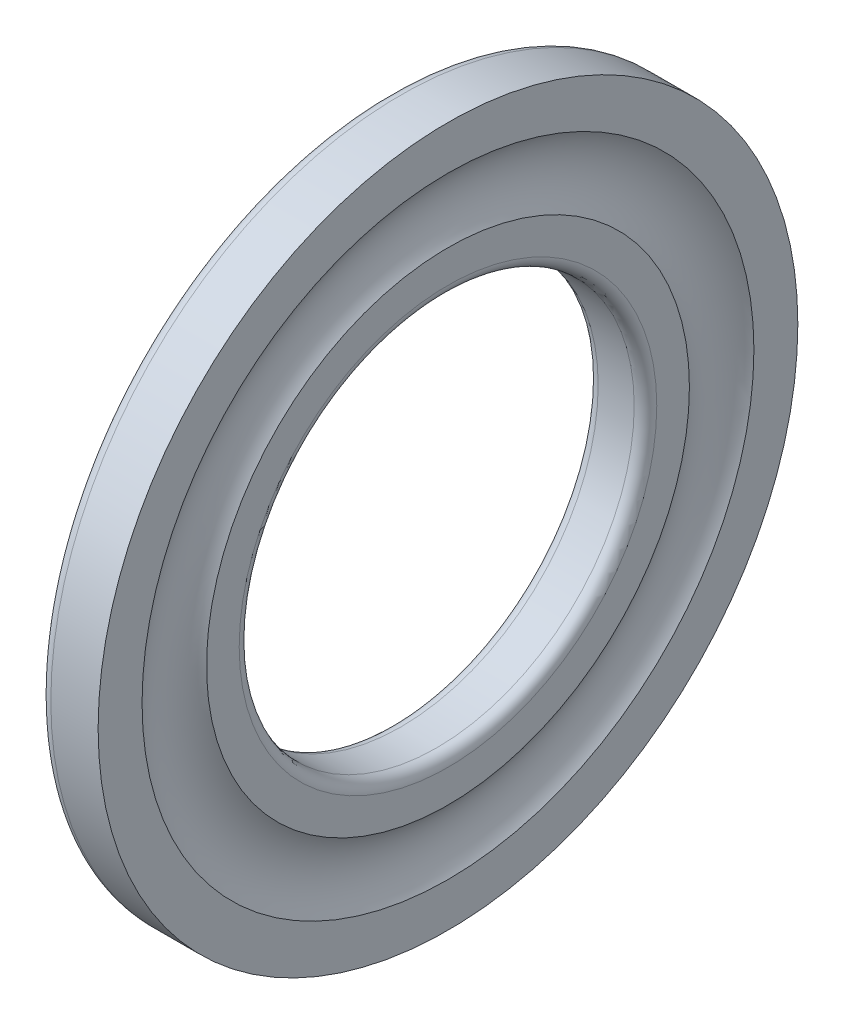
ISO-10303-21;
HEADER;
FILE_DESCRIPTION(('STEP AP214'),'2;1');
FILE_NAME('part.step','',(''),(''),'','','');
FILE_SCHEMA(('AUTOMOTIVE_DESIGN { 1 0 10303 214 1 1 1 1 }'));
ENDSEC;
DATA;
#1=APPLICATION_CONTEXT('core data for automotive mechanical design processes');
#2=APPLICATION_PROTOCOL_DEFINITION('international standard','automotive_design',2000,#1);
#3=PRODUCT_CONTEXT('',#1,'mechanical');
#4=PRODUCT('Part','Part','',(#3));
#5=PRODUCT_RELATED_PRODUCT_CATEGORY('part','',(#4));
#6=PRODUCT_DEFINITION_FORMATION('','',#4);
#7=PRODUCT_DEFINITION_CONTEXT('part definition',#1,'design');
#8=PRODUCT_DEFINITION('design','',#6,#7);
#9=PRODUCT_DEFINITION_SHAPE('','',#8);
#10=(LENGTH_UNIT() NAMED_UNIT(*) SI_UNIT(.MILLI.,.METRE.));
#11=(NAMED_UNIT(*) PLANE_ANGLE_UNIT() SI_UNIT($,.RADIAN.));
#12=(NAMED_UNIT(*) SI_UNIT($,.STERADIAN.) SOLID_ANGLE_UNIT());
#13=UNCERTAINTY_MEASURE_WITH_UNIT(LENGTH_MEASURE(1.E-05),#10,'distance_accuracy_value','');
#14=(GEOMETRIC_REPRESENTATION_CONTEXT(3) GLOBAL_UNCERTAINTY_ASSIGNED_CONTEXT((#13)) GLOBAL_UNIT_ASSIGNED_CONTEXT((#10,
#11,#12)) REPRESENTATION_CONTEXT('',''));
#15=CARTESIAN_POINT('',(0.,0.,0.));
#16=DIRECTION('',(0.,0.,1.));
#17=DIRECTION('',(1.,0.,0.));
#18=AXIS2_PLACEMENT_3D('',#15,#16,#17);
#19=CARTESIAN_POINT('',(5.19,18.5,0.));
#20=DIRECTION('',(1.,0.,0.));
#21=DIRECTION('',(0.,0.,-1.));
#22=AXIS2_PLACEMENT_3D('',#19,#20,#21);
#23=PLANE('',#22);
#24=CARTESIAN_POINT('',(5.19,0.,0.));
#25=DIRECTION('',(1.,0.,0.));
#26=DIRECTION('',(0.,0.,-1.));
#27=AXIS2_PLACEMENT_3D('',#24,#25,#26);
#28=CIRCLE('',#27,18.5);
#29=CARTESIAN_POINT('',(5.19,0.,-18.5));
#30=VERTEX_POINT('',#29);
#31=EDGE_CURVE('E114',#30,#30,#28,.T.);
#32=ORIENTED_EDGE('',*,*,#31,.F.);
#33=EDGE_LOOP('',(#32));
#34=FACE_BOUND('',#33,.T.);
#35=CARTESIAN_POINT('',(5.19,0.,0.));
#36=DIRECTION('',(1.,0.,0.));
#37=DIRECTION('',(0.,0.,-1.));
#38=AXIS2_PLACEMENT_3D('',#35,#36,#37);
#39=CIRCLE('',#38,21.3925);
#40=CARTESIAN_POINT('',(5.19,0.,-21.3925));
#41=VERTEX_POINT('',#40);
#42=EDGE_CURVE('E18',#41,#41,#39,.T.);
#43=ORIENTED_EDGE('',*,*,#42,.T.);
#44=EDGE_LOOP('',(#43));
#45=FACE_BOUND('',#44,.T.);
#46=ADVANCED_FACE('F14',(#34,#45),#23,.T.);
#47=CARTESIAN_POINT('',(8.99999999999999,0.,0.));
#48=DIRECTION('',(1.,0.,0.));
#49=DIRECTION('',(0.,0.,-1.));
#50=AXIS2_PLACEMENT_3D('',#47,#48,#49);
#51=TOROIDAL_SURFACE('',#50,24.25,4.7625);
#52=CARTESIAN_POINT('',(5.19,0.,0.));
#53=DIRECTION('',(1.,0.,0.));
#54=DIRECTION('',(0.,0.,-1.));
#55=AXIS2_PLACEMENT_3D('',#52,#53,#54);
#56=CIRCLE('',#55,27.1075);
#57=CARTESIAN_POINT('',(5.19,0.,-27.1075));
#58=VERTEX_POINT('',#57);
#59=EDGE_CURVE('E85',#58,#58,#56,.F.);
#60=ORIENTED_EDGE('',*,*,#59,.F.);
#61=EDGE_LOOP('',(#60));
#62=FACE_BOUND('',#61,.T.);
#63=ORIENTED_EDGE('',*,*,#42,.F.);
#64=EDGE_LOOP('',(#63));
#65=FACE_BOUND('',#64,.T.);
#66=ADVANCED_FACE('F98',(#62,#65),#51,.F.);
#67=CARTESIAN_POINT('',(4.19,0.,0.));
#68=DIRECTION('',(1.,0.,0.));
#69=DIRECTION('',(0.,0.,-1.));
#70=AXIS2_PLACEMENT_3D('',#67,#68,#69);
#71=TOROIDAL_SURFACE('',#70,18.5,0.999999999999997);
#72=CARTESIAN_POINT('',(4.19,0.,0.));
#73=DIRECTION('',(-1.,0.,0.));
#74=DIRECTION('',(0.,0.,1.));
#75=AXIS2_PLACEMENT_3D('',#72,#73,#74);
#76=CIRCLE('',#75,17.5);
#77=CARTESIAN_POINT('',(4.19,0.,17.5));
#78=VERTEX_POINT('',#77);
#79=EDGE_CURVE('E77',#78,#78,#76,.T.);
#80=ORIENTED_EDGE('',*,*,#79,.T.);
#81=EDGE_LOOP('',(#80));
#82=FACE_BOUND('',#81,.T.);
#83=ORIENTED_EDGE('',*,*,#31,.T.);
#84=EDGE_LOOP('',(#83));
#85=FACE_BOUND('',#84,.T.);
#86=ADVANCED_FACE('F93',(#82,#85),#71,.T.);
#87=CARTESIAN_POINT('',(5.19,27.1075,0.));
#88=DIRECTION('',(1.,0.,0.));
#89=DIRECTION('',(0.,0.,-1.));
#90=AXIS2_PLACEMENT_3D('',#87,#88,#89);
#91=PLANE('',#90);
#92=ORIENTED_EDGE('',*,*,#59,.T.);
#93=EDGE_LOOP('',(#92));
#94=FACE_BOUND('',#93,.T.);
#95=CARTESIAN_POINT('',(5.19,0.,0.));
#96=DIRECTION('',(-1.,0.,0.));
#97=DIRECTION('',(0.,0.,1.));
#98=AXIS2_PLACEMENT_3D('',#95,#96,#97);
#99=CIRCLE('',#98,31.);
#100=CARTESIAN_POINT('',(5.19,0.,31.));
#101=VERTEX_POINT('',#100);
#102=EDGE_CURVE('E37',#101,#101,#99,.T.);
#103=ORIENTED_EDGE('',*,*,#102,.F.);
#104=EDGE_LOOP('',(#103));
#105=FACE_BOUND('',#104,.T.);
#106=ADVANCED_FACE('F97',(#94,#105),#91,.T.);
#107=CARTESIAN_POINT('',(5.19,0.,0.));
#108=DIRECTION('',(-1.,0.,0.));
#109=DIRECTION('',(0.,0.,1.));
#110=AXIS2_PLACEMENT_3D('',#107,#108,#109);
#111=CYLINDRICAL_SURFACE('',#110,17.5);
#112=CARTESIAN_POINT('',(0.999999999999998,0.,0.));
#113=DIRECTION('',(1.,0.,0.));
#114=DIRECTION('',(0.,0.,-1.));
#115=AXIS2_PLACEMENT_3D('',#112,#113,#114);
#116=CIRCLE('',#115,17.5);
#117=CARTESIAN_POINT('',(0.999999999999998,0.,-17.5));
#118=VERTEX_POINT('',#117);
#119=EDGE_CURVE('E32',#118,#118,#116,.T.);
#120=ORIENTED_EDGE('',*,*,#119,.F.);
#121=EDGE_LOOP('',(#120));
#122=FACE_BOUND('',#121,.T.);
#123=ORIENTED_EDGE('',*,*,#79,.F.);
#124=EDGE_LOOP('',(#123));
#125=FACE_BOUND('',#124,.T.);
#126=ADVANCED_FACE('F149',(#122,#125),#111,.F.);
#127=CARTESIAN_POINT('',(5.19,0.,0.));
#128=DIRECTION('',(-1.,0.,0.));
#129=DIRECTION('',(0.,0.,1.));
#130=AXIS2_PLACEMENT_3D('',#127,#128,#129);
#131=CYLINDRICAL_SURFACE('',#130,31.);
#132=ORIENTED_EDGE('',*,*,#102,.T.);
#133=EDGE_LOOP('',(#132));
#134=FACE_BOUND('',#133,.T.);
#135=CARTESIAN_POINT('',(0.999999999999999,0.,0.));
#136=DIRECTION('',(1.,0.,0.));
#137=DIRECTION('',(0.,0.,-1.));
#138=AXIS2_PLACEMENT_3D('',#135,#136,#137);
#139=CIRCLE('',#138,31.);
#140=CARTESIAN_POINT('',(0.999999999999999,0.,-31.));
#141=VERTEX_POINT('',#140);
#142=EDGE_CURVE('E27',#141,#141,#139,.F.);
#143=ORIENTED_EDGE('',*,*,#142,.F.);
#144=EDGE_LOOP('',(#143));
#145=FACE_BOUND('',#144,.T.);
#146=ADVANCED_FACE('F68',(#134,#145),#131,.T.);
#147=CARTESIAN_POINT('',(0.999999999999998,0.,0.));
#148=DIRECTION('',(1.,0.,0.));
#149=DIRECTION('',(0.,0.,-1.));
#150=AXIS2_PLACEMENT_3D('',#147,#148,#149);
#151=TOROIDAL_SURFACE('',#150,18.5,0.999999999999998);
#152=CARTESIAN_POINT('',(0.,0.,0.));
#153=DIRECTION('',(-1.,0.,0.));
#154=DIRECTION('',(0.,0.,-1.));
#155=AXIS2_PLACEMENT_3D('',#152,#153,#154);
#156=CIRCLE('',#155,18.5);
#157=CARTESIAN_POINT('',(0.,0.,-18.5));
#158=VERTEX_POINT('',#157);
#159=EDGE_CURVE('E22',#158,#158,#156,.F.);
#160=ORIENTED_EDGE('',*,*,#159,.F.);
#161=EDGE_LOOP('',(#160));
#162=FACE_BOUND('',#161,.T.);
#163=ORIENTED_EDGE('',*,*,#119,.T.);
#164=EDGE_LOOP('',(#163));
#165=FACE_BOUND('',#164,.T.);
#166=ADVANCED_FACE('F63',(#162,#165),#151,.T.);
#167=CARTESIAN_POINT('',(0.999999999999999,0.,0.));
#168=DIRECTION('',(1.,0.,0.));
#169=DIRECTION('',(0.,0.,-1.));
#170=AXIS2_PLACEMENT_3D('',#167,#168,#169);
#171=TOROIDAL_SURFACE('',#170,30.,1.);
#172=ORIENTED_EDGE('',*,*,#142,.T.);
#173=EDGE_LOOP('',(#172));
#174=FACE_BOUND('',#173,.T.);
#175=CARTESIAN_POINT('',(0.,0.,0.));
#176=DIRECTION('',(1.,0.,0.));
#177=DIRECTION('',(0.,0.,-1.));
#178=AXIS2_PLACEMENT_3D('',#175,#176,#177);
#179=CIRCLE('',#178,30.);
#180=CARTESIAN_POINT('',(0.,0.,-30.));
#181=VERTEX_POINT('',#180);
#182=EDGE_CURVE('E10',#181,#181,#179,.F.);
#183=ORIENTED_EDGE('',*,*,#182,.F.);
#184=EDGE_LOOP('',(#183));
#185=FACE_BOUND('',#184,.T.);
#186=ADVANCED_FACE('F52',(#174,#185),#171,.T.);
#187=CARTESIAN_POINT('',(0.,30.,0.));
#188=DIRECTION('',(-1.,0.,0.));
#189=DIRECTION('',(0.,0.,1.));
#190=AXIS2_PLACEMENT_3D('',#187,#188,#189);
#191=PLANE('',#190);
#192=ORIENTED_EDGE('',*,*,#182,.T.);
#193=EDGE_LOOP('',(#192));
#194=FACE_BOUND('',#193,.T.);
#195=ORIENTED_EDGE('',*,*,#159,.T.);
#196=EDGE_LOOP('',(#195));
#197=FACE_BOUND('',#196,.T.);
#198=ADVANCED_FACE('F62',(#194,#197),#191,.T.);
#199=CLOSED_SHELL('',(#46,#66,#86,#106,#126,#146,#166,#186,#198));
#200=MANIFOLD_SOLID_BREP('B1',#199);
#201=ADVANCED_BREP_SHAPE_REPRESENTATION('',(#18,#200),#14);
#202=SHAPE_DEFINITION_REPRESENTATION(#9,#201);
ENDSEC;
END-ISO-10303-21;
